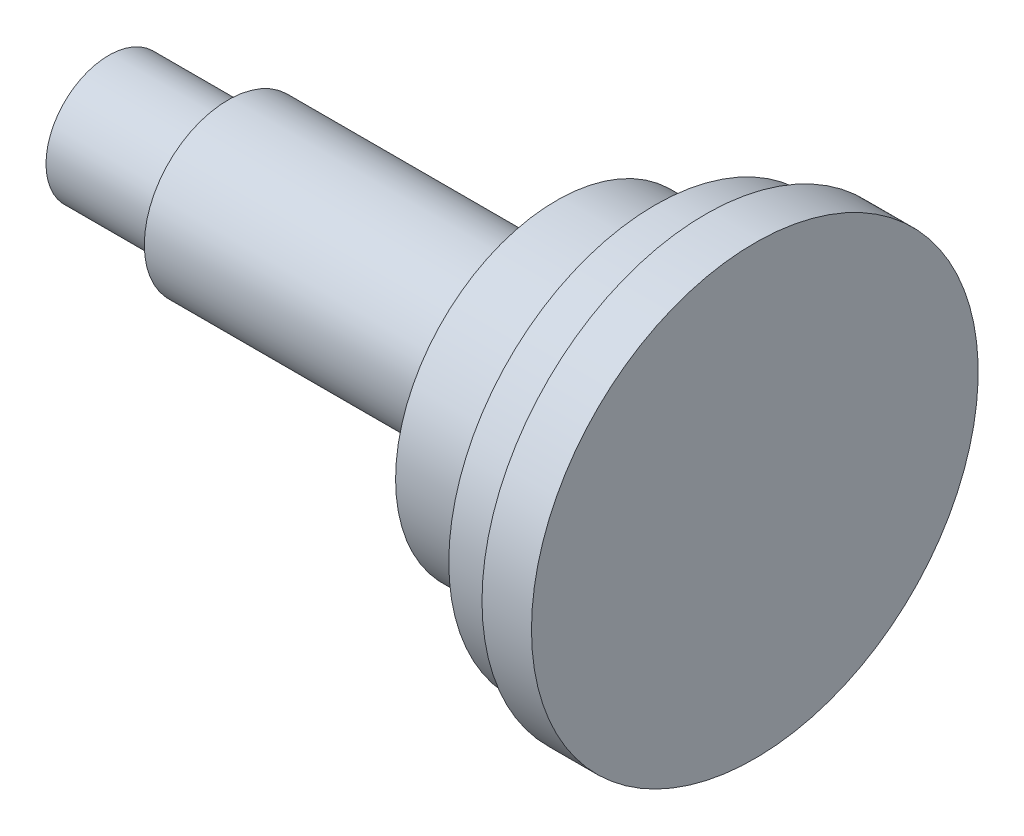
ISO-10303-21;
HEADER;
FILE_DESCRIPTION(('STEP AP214'),'2;1');
FILE_NAME('part.step','',(''),(''),'','','');
FILE_SCHEMA(('AUTOMOTIVE_DESIGN { 1 0 10303 214 1 1 1 1 }'));
ENDSEC;
DATA;
#1=APPLICATION_CONTEXT('core data for automotive mechanical design processes');
#2=APPLICATION_PROTOCOL_DEFINITION('international standard','automotive_design',2000,#1);
#3=PRODUCT_CONTEXT('',#1,'mechanical');
#4=PRODUCT('Part','Part','',(#3));
#5=PRODUCT_RELATED_PRODUCT_CATEGORY('part','',(#4));
#6=PRODUCT_DEFINITION_FORMATION('','',#4);
#7=PRODUCT_DEFINITION_CONTEXT('part definition',#1,'design');
#8=PRODUCT_DEFINITION('design','',#6,#7);
#9=PRODUCT_DEFINITION_SHAPE('','',#8);
#10=(LENGTH_UNIT() NAMED_UNIT(*) SI_UNIT(.MILLI.,.METRE.));
#11=(NAMED_UNIT(*) PLANE_ANGLE_UNIT() SI_UNIT($,.RADIAN.));
#12=(NAMED_UNIT(*) SI_UNIT($,.STERADIAN.) SOLID_ANGLE_UNIT());
#13=UNCERTAINTY_MEASURE_WITH_UNIT(LENGTH_MEASURE(1.E-05),#10,'distance_accuracy_value','');
#14=(GEOMETRIC_REPRESENTATION_CONTEXT(3) GLOBAL_UNCERTAINTY_ASSIGNED_CONTEXT((#13)) GLOBAL_UNIT_ASSIGNED_CONTEXT((#10,
#11,#12)) REPRESENTATION_CONTEXT('',''));
#15=CARTESIAN_POINT('',(0.,0.,0.));
#16=DIRECTION('',(0.,0.,1.));
#17=DIRECTION('',(1.,0.,0.));
#18=AXIS2_PLACEMENT_3D('',#15,#16,#17);
#19=CARTESIAN_POINT('',(-64.5109674221455,0.,0.));
#20=DIRECTION('',(1.,0.,0.));
#21=DIRECTION('',(0.,0.,-1.));
#22=AXIS2_PLACEMENT_3D('',#19,#20,#21);
#23=PLANE('',#22);
#24=CARTESIAN_POINT('',(-64.5109674221455,0.,0.));
#25=DIRECTION('',(-1.,0.,0.));
#26=DIRECTION('',(0.,0.,1.));
#27=AXIS2_PLACEMENT_3D('',#24,#25,#26);
#28=CIRCLE('',#27,9.55);
#29=CARTESIAN_POINT('',(-64.5109674221455,0.,9.55));
#30=VERTEX_POINT('',#29);
#31=EDGE_CURVE('E10',#30,#30,#28,.T.);
#32=ORIENTED_EDGE('',*,*,#31,.T.);
#33=EDGE_LOOP('',(#32));
#34=FACE_BOUND('',#33,.T.);
#35=ADVANCED_FACE('F37',(#34),#23,.F.);
#36=CARTESIAN_POINT('',(-64.5109674221455,0.,0.));
#37=DIRECTION('',(-1.,0.,0.));
#38=DIRECTION('',(0.,0.,1.));
#39=AXIS2_PLACEMENT_3D('',#36,#37,#38);
#40=CYLINDRICAL_SURFACE('',#39,9.55);
#41=ORIENTED_EDGE('',*,*,#31,.F.);
#42=EDGE_LOOP('',(#41));
#43=FACE_BOUND('',#42,.T.);
#44=CARTESIAN_POINT('',(-46.3457490599391,0.,0.));
#45=DIRECTION('',(-1.,0.,0.));
#46=DIRECTION('',(0.,0.,1.));
#47=AXIS2_PLACEMENT_3D('',#44,#45,#46);
#48=CIRCLE('',#47,9.55);
#49=CARTESIAN_POINT('',(-46.3457490599391,0.,9.55));
#50=VERTEX_POINT('',#49);
#51=EDGE_CURVE('E43',#50,#50,#48,.T.);
#52=ORIENTED_EDGE('',*,*,#51,.T.);
#53=EDGE_LOOP('',(#52));
#54=FACE_BOUND('',#53,.T.);
#55=ADVANCED_FACE('F87',(#43,#54),#40,.T.);
#56=CARTESIAN_POINT('',(-46.3457490599391,9.55,0.));
#57=DIRECTION('',(1.,0.,0.));
#58=DIRECTION('',(0.,0.,-1.));
#59=AXIS2_PLACEMENT_3D('',#56,#57,#58);
#60=PLANE('',#59);
#61=ORIENTED_EDGE('',*,*,#51,.F.);
#62=EDGE_LOOP('',(#61));
#63=FACE_BOUND('',#62,.T.);
#64=CARTESIAN_POINT('',(-46.3457490599391,0.,0.));
#65=DIRECTION('',(-1.,0.,0.));
#66=DIRECTION('',(0.,0.,1.));
#67=AXIS2_PLACEMENT_3D('',#64,#65,#66);
#68=CIRCLE('',#67,12.75);
#69=CARTESIAN_POINT('',(-46.3457490599391,0.,12.75));
#70=VERTEX_POINT('',#69);
#71=EDGE_CURVE('E47',#70,#70,#68,.T.);
#72=ORIENTED_EDGE('',*,*,#71,.T.);
#73=EDGE_LOOP('',(#72));
#74=FACE_BOUND('',#73,.T.);
#75=ADVANCED_FACE('F91',(#63,#74),#60,.F.);
#76=CARTESIAN_POINT('',(-64.5109674221455,0.,0.));
#77=DIRECTION('',(-1.,0.,0.));
#78=DIRECTION('',(0.,0.,1.));
#79=AXIS2_PLACEMENT_3D('',#76,#77,#78);
#80=CYLINDRICAL_SURFACE('',#79,12.75);
#81=ORIENTED_EDGE('',*,*,#71,.F.);
#82=EDGE_LOOP('',(#81));
#83=FACE_BOUND('',#82,.T.);
#84=CARTESIAN_POINT('',(3.65425094006086,0.,0.));
#85=DIRECTION('',(-1.,0.,0.));
#86=DIRECTION('',(0.,0.,1.));
#87=AXIS2_PLACEMENT_3D('',#84,#85,#86);
#88=CIRCLE('',#87,12.75);
#89=CARTESIAN_POINT('',(3.65425094006086,0.,12.75));
#90=VERTEX_POINT('',#89);
#91=EDGE_CURVE('E51',#90,#90,#88,.T.);
#92=ORIENTED_EDGE('',*,*,#91,.T.);
#93=EDGE_LOOP('',(#92));
#94=FACE_BOUND('',#93,.T.);
#95=ADVANCED_FACE('F96',(#83,#94),#80,.T.);
#96=CARTESIAN_POINT('',(3.65425094006086,12.75,0.));
#97=DIRECTION('',(1.,0.,0.));
#98=DIRECTION('',(0.,0.,-1.));
#99=AXIS2_PLACEMENT_3D('',#96,#97,#98);
#100=PLANE('',#99);
#101=ORIENTED_EDGE('',*,*,#91,.F.);
#102=EDGE_LOOP('',(#101));
#103=FACE_BOUND('',#102,.T.);
#104=CARTESIAN_POINT('',(3.65425094006086,0.,0.));
#105=DIRECTION('',(-1.,0.,0.));
#106=DIRECTION('',(0.,0.,1.));
#107=AXIS2_PLACEMENT_3D('',#104,#105,#106);
#108=CIRCLE('',#107,24.5);
#109=CARTESIAN_POINT('',(3.65425094006086,0.,24.5));
#110=VERTEX_POINT('',#109);
#111=EDGE_CURVE('E56',#110,#110,#108,.T.);
#112=ORIENTED_EDGE('',*,*,#111,.T.);
#113=EDGE_LOOP('',(#112));
#114=FACE_BOUND('',#113,.T.);
#115=ADVANCED_FACE('F102',(#103,#114),#100,.F.);
#116=CARTESIAN_POINT('',(-64.5109674221455,0.,0.));
#117=DIRECTION('',(-1.,0.,0.));
#118=DIRECTION('',(0.,0.,1.));
#119=AXIS2_PLACEMENT_3D('',#116,#117,#118);
#120=CYLINDRICAL_SURFACE('',#119,24.5);
#121=ORIENTED_EDGE('',*,*,#111,.F.);
#122=EDGE_LOOP('',(#121));
#123=FACE_BOUND('',#122,.T.);
#124=CARTESIAN_POINT('',(18.6542509400609,0.,0.));
#125=DIRECTION('',(-1.,0.,0.));
#126=DIRECTION('',(0.,0.,1.));
#127=AXIS2_PLACEMENT_3D('',#124,#125,#126);
#128=CIRCLE('',#127,24.5);
#129=CARTESIAN_POINT('',(18.6542509400609,0.,24.5));
#130=VERTEX_POINT('',#129);
#131=EDGE_CURVE('E59',#130,#130,#128,.T.);
#132=ORIENTED_EDGE('',*,*,#131,.T.);
#133=EDGE_LOOP('',(#132));
#134=FACE_BOUND('',#133,.T.);
#135=ADVANCED_FACE('F106',(#123,#134),#120,.T.);
#136=CARTESIAN_POINT('',(18.6542509400609,24.5,0.));
#137=DIRECTION('',(1.,0.,0.));
#138=DIRECTION('',(0.,0.,-1.));
#139=AXIS2_PLACEMENT_3D('',#136,#137,#138);
#140=PLANE('',#139);
#141=ORIENTED_EDGE('',*,*,#131,.F.);
#142=EDGE_LOOP('',(#141));
#143=FACE_BOUND('',#142,.T.);
#144=CARTESIAN_POINT('',(18.6542509400609,0.,0.));
#145=DIRECTION('',(-1.,0.,0.));
#146=DIRECTION('',(0.,0.,1.));
#147=AXIS2_PLACEMENT_3D('',#144,#145,#146);
#148=CIRCLE('',#147,31.4);
#149=CARTESIAN_POINT('',(18.6542509400609,0.,31.4));
#150=VERTEX_POINT('',#149);
#151=EDGE_CURVE('E62',#150,#150,#148,.T.);
#152=ORIENTED_EDGE('',*,*,#151,.T.);
#153=EDGE_LOOP('',(#152));
#154=FACE_BOUND('',#153,.T.);
#155=ADVANCED_FACE('F110',(#143,#154),#140,.F.);
#156=CARTESIAN_POINT('',(-64.5109674221455,0.,0.));
#157=DIRECTION('',(-1.,0.,0.));
#158=DIRECTION('',(0.,0.,1.));
#159=AXIS2_PLACEMENT_3D('',#156,#157,#158);
#160=CYLINDRICAL_SURFACE('',#159,31.4);
#161=ORIENTED_EDGE('',*,*,#151,.F.);
#162=EDGE_LOOP('',(#161));
#163=FACE_BOUND('',#162,.T.);
#164=CARTESIAN_POINT('',(26.3095929641335,0.,0.));
#165=DIRECTION('',(-1.,0.,0.));
#166=DIRECTION('',(0.,0.,1.));
#167=AXIS2_PLACEMENT_3D('',#164,#165,#166);
#168=CIRCLE('',#167,31.4);
#169=CARTESIAN_POINT('',(26.3095929641335,0.,31.4));
#170=VERTEX_POINT('',#169);
#171=EDGE_CURVE('E65',#170,#170,#168,.T.);
#172=ORIENTED_EDGE('',*,*,#171,.T.);
#173=EDGE_LOOP('',(#172));
#174=FACE_BOUND('',#173,.T.);
#175=ADVANCED_FACE('F114',(#163,#174),#160,.T.);
#176=CARTESIAN_POINT('',(26.3095929641335,31.4,0.));
#177=DIRECTION('',(1.,0.,0.));
#178=DIRECTION('',(0.,0.,-1.));
#179=AXIS2_PLACEMENT_3D('',#176,#177,#178);
#180=PLANE('',#179);
#181=ORIENTED_EDGE('',*,*,#171,.F.);
#182=EDGE_LOOP('',(#181));
#183=FACE_BOUND('',#182,.T.);
#184=CARTESIAN_POINT('',(26.3095929641335,0.,0.));
#185=DIRECTION('',(-1.,0.,0.));
#186=DIRECTION('',(0.,0.,1.));
#187=AXIS2_PLACEMENT_3D('',#184,#185,#186);
#188=CIRCLE('',#187,34.);
#189=CARTESIAN_POINT('',(26.3095929641335,0.,34.));
#190=VERTEX_POINT('',#189);
#191=EDGE_CURVE('E68',#190,#190,#188,.T.);
#192=ORIENTED_EDGE('',*,*,#191,.T.);
#193=EDGE_LOOP('',(#192));
#194=FACE_BOUND('',#193,.T.);
#195=ADVANCED_FACE('F83',(#183,#194),#180,.F.);
#196=CARTESIAN_POINT('',(-64.5109674221455,0.,0.));
#197=DIRECTION('',(-1.,0.,0.));
#198=DIRECTION('',(0.,0.,1.));
#199=AXIS2_PLACEMENT_3D('',#196,#197,#198);
#200=CYLINDRICAL_SURFACE('',#199,34.);
#201=ORIENTED_EDGE('',*,*,#191,.F.);
#202=EDGE_LOOP('',(#201));
#203=FACE_BOUND('',#202,.T.);
#204=CARTESIAN_POINT('',(33.8407148532287,0.,0.));
#205=DIRECTION('',(-1.,0.,0.));
#206=DIRECTION('',(0.,0.,1.));
#207=AXIS2_PLACEMENT_3D('',#204,#205,#206);
#208=CIRCLE('',#207,34.);
#209=CARTESIAN_POINT('',(33.8407148532287,0.,34.));
#210=VERTEX_POINT('',#209);
#211=EDGE_CURVE('E71',#210,#210,#208,.T.);
#212=ORIENTED_EDGE('',*,*,#211,.T.);
#213=EDGE_LOOP('',(#212));
#214=FACE_BOUND('',#213,.T.);
#215=ADVANCED_FACE('F75',(#203,#214),#200,.T.);
#216=CARTESIAN_POINT('',(33.8407148532287,34.,0.));
#217=DIRECTION('',(-1.,0.,0.));
#218=DIRECTION('',(0.,0.,1.));
#219=AXIS2_PLACEMENT_3D('',#216,#217,#218);
#220=PLANE('',#219);
#221=ORIENTED_EDGE('',*,*,#211,.F.);
#222=EDGE_LOOP('',(#221));
#223=FACE_BOUND('',#222,.T.);
#224=ADVANCED_FACE('F77',(#223),#220,.F.);
#225=CLOSED_SHELL('',(#35,#55,#75,#95,#115,#135,#155,#175,#195,#215,#224));
#226=MANIFOLD_SOLID_BREP('B2',#225);
#227=ADVANCED_BREP_SHAPE_REPRESENTATION('',(#18,#226),#14);
#228=SHAPE_DEFINITION_REPRESENTATION(#9,#227);
ENDSEC;
END-ISO-10303-21;
